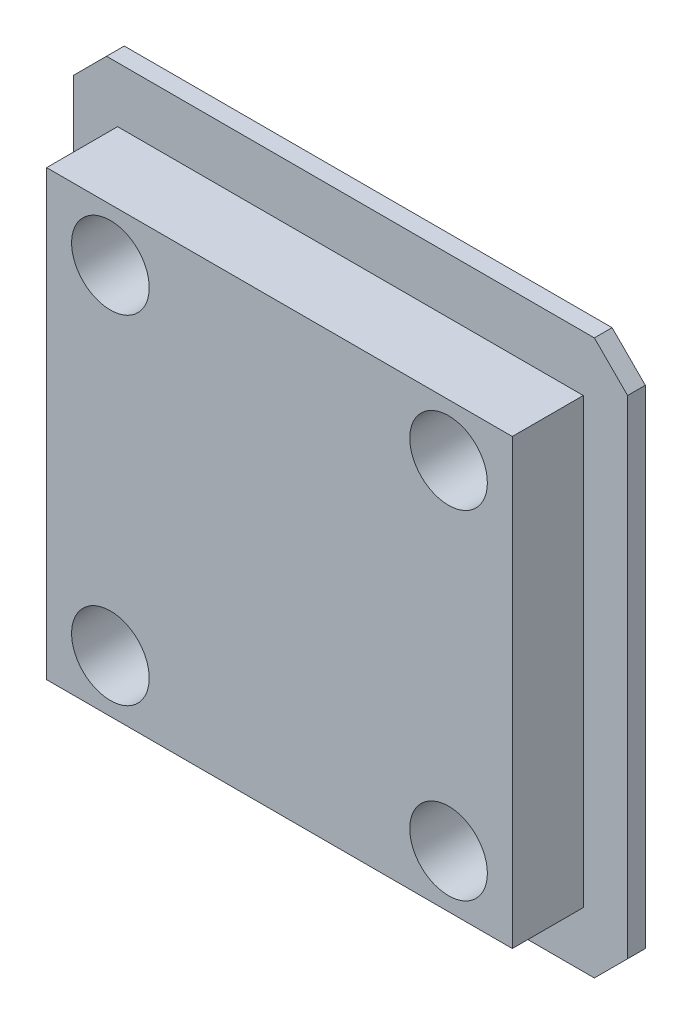
ISO-10303-21;
HEADER;
FILE_DESCRIPTION(('STEP AP214'),'2;1');
FILE_NAME('part.step','',(''),(''),'','','');
FILE_SCHEMA(('AUTOMOTIVE_DESIGN { 1 0 10303 214 1 1 1 1 }'));
ENDSEC;
DATA;
#1=APPLICATION_CONTEXT('core data for automotive mechanical design processes');
#2=APPLICATION_PROTOCOL_DEFINITION('international standard','automotive_design',2000,#1);
#3=PRODUCT_CONTEXT('',#1,'mechanical');
#4=PRODUCT('Part','Part','',(#3));
#5=PRODUCT_RELATED_PRODUCT_CATEGORY('part','',(#4));
#6=PRODUCT_DEFINITION_FORMATION('','',#4);
#7=PRODUCT_DEFINITION_CONTEXT('part definition',#1,'design');
#8=PRODUCT_DEFINITION('design','',#6,#7);
#9=PRODUCT_DEFINITION_SHAPE('','',#8);
#10=(LENGTH_UNIT() NAMED_UNIT(*) SI_UNIT(.MILLI.,.METRE.));
#11=(NAMED_UNIT(*) PLANE_ANGLE_UNIT() SI_UNIT($,.RADIAN.));
#12=(NAMED_UNIT(*) SI_UNIT($,.STERADIAN.) SOLID_ANGLE_UNIT());
#13=UNCERTAINTY_MEASURE_WITH_UNIT(LENGTH_MEASURE(1.E-05),#10,'distance_accuracy_value','');
#14=(GEOMETRIC_REPRESENTATION_CONTEXT(3) GLOBAL_UNCERTAINTY_ASSIGNED_CONTEXT((#13)) GLOBAL_UNIT_ASSIGNED_CONTEXT((#10,
#11,#12)) REPRESENTATION_CONTEXT('',''));
#15=CARTESIAN_POINT('',(0.,0.,0.));
#16=DIRECTION('',(0.,0.,1.));
#17=DIRECTION('',(1.,0.,0.));
#18=AXIS2_PLACEMENT_3D('',#15,#16,#17);
#19=CARTESIAN_POINT('',(0.,0.,1.6));
#20=DIRECTION('',(0.,0.,1.));
#21=DIRECTION('',(1.,0.,0.));
#22=AXIS2_PLACEMENT_3D('',#19,#20,#21);
#23=PLANE('',#22);
#24=DIRECTION('',(0.707106781186547,-0.707106781186547,0.));
#25=VECTOR('',#24,1.);
#26=CARTESIAN_POINT('',(-25.,-22.,1.6));
#27=LINE('',#26,#25);
#28=CARTESIAN_POINT('',(-25.,-22.,1.6));
#29=VERTEX_POINT('',#28);
#30=CARTESIAN_POINT('',(-22.,-25.,1.6));
#31=VERTEX_POINT('',#30);
#32=EDGE_CURVE('E166',#29,#31,#27,.T.);
#33=ORIENTED_EDGE('',*,*,#32,.T.);
#34=DIRECTION('',(1.,0.,0.));
#35=VECTOR('',#34,1.);
#36=CARTESIAN_POINT('',(-22.,-25.,1.6));
#37=LINE('',#36,#35);
#38=CARTESIAN_POINT('',(22.,-25.,1.6));
#39=VERTEX_POINT('',#38);
#40=EDGE_CURVE('E106',#31,#39,#37,.T.);
#41=ORIENTED_EDGE('',*,*,#40,.T.);
#42=DIRECTION('',(0.707106781186547,0.707106781186547,0.));
#43=VECTOR('',#42,1.);
#44=CARTESIAN_POINT('',(22.,-25.,1.6));
#45=LINE('',#44,#43);
#46=CARTESIAN_POINT('',(25.,-22.,1.6));
#47=VERTEX_POINT('',#46);
#48=EDGE_CURVE('E181',#39,#47,#45,.T.);
#49=ORIENTED_EDGE('',*,*,#48,.T.);
#50=DIRECTION('',(0.,1.,0.));
#51=VECTOR('',#50,1.);
#52=CARTESIAN_POINT('',(25.,-22.,1.6));
#53=LINE('',#52,#51);
#54=CARTESIAN_POINT('',(25.,22.,1.6));
#55=VERTEX_POINT('',#54);
#56=EDGE_CURVE('E194',#47,#55,#53,.T.);
#57=ORIENTED_EDGE('',*,*,#56,.T.);
#58=DIRECTION('',(-0.707106781186547,0.707106781186547,0.));
#59=VECTOR('',#58,1.);
#60=CARTESIAN_POINT('',(25.,22.,1.6));
#61=LINE('',#60,#59);
#62=CARTESIAN_POINT('',(22.,25.,1.6));
#63=VERTEX_POINT('',#62);
#64=EDGE_CURVE('E129',#55,#63,#61,.T.);
#65=ORIENTED_EDGE('',*,*,#64,.T.);
#66=DIRECTION('',(-1.,0.,0.));
#67=VECTOR('',#66,1.);
#68=CARTESIAN_POINT('',(22.,25.,1.6));
#69=LINE('',#68,#67);
#70=CARTESIAN_POINT('',(-22.,25.,1.6));
#71=VERTEX_POINT('',#70);
#72=EDGE_CURVE('E122',#63,#71,#69,.T.);
#73=ORIENTED_EDGE('',*,*,#72,.T.);
#74=DIRECTION('',(-0.707106781186547,-0.707106781186547,0.));
#75=VECTOR('',#74,1.);
#76=CARTESIAN_POINT('',(-22.,25.,1.6));
#77=LINE('',#76,#75);
#78=CARTESIAN_POINT('',(-25.,22.,1.6));
#79=VERTEX_POINT('',#78);
#80=EDGE_CURVE('E126',#71,#79,#77,.T.);
#81=ORIENTED_EDGE('',*,*,#80,.T.);
#82=DIRECTION('',(0.,-1.,0.));
#83=VECTOR('',#82,1.);
#84=CARTESIAN_POINT('',(-25.,22.,1.6));
#85=LINE('',#84,#83);
#86=EDGE_CURVE('E65',#79,#29,#85,.T.);
#87=ORIENTED_EDGE('',*,*,#86,.T.);
#88=EDGE_LOOP('',(#33,#41,#49,#57,#65,#73,#81,#87));
#89=FACE_BOUND('',#88,.T.);
#90=DIRECTION('',(1.,0.,0.));
#91=VECTOR('',#90,1.);
#92=CARTESIAN_POINT('',(-21.,-20.,1.6));
#93=LINE('',#92,#91);
#94=CARTESIAN_POINT('',(-21.,-20.,1.6));
#95=VERTEX_POINT('',#94);
#96=CARTESIAN_POINT('',(21.,-20.,1.6));
#97=VERTEX_POINT('',#96);
#98=EDGE_CURVE('E241',#95,#97,#93,.T.);
#99=ORIENTED_EDGE('',*,*,#98,.F.);
#100=DIRECTION('',(0.,-1.,0.));
#101=VECTOR('',#100,1.);
#102=CARTESIAN_POINT('',(-21.,20.,1.6));
#103=LINE('',#102,#101);
#104=CARTESIAN_POINT('',(-21.,20.,1.6));
#105=VERTEX_POINT('',#104);
#106=EDGE_CURVE('E225',#105,#95,#103,.T.);
#107=ORIENTED_EDGE('',*,*,#106,.F.);
#108=DIRECTION('',(-1.,0.,0.));
#109=VECTOR('',#108,1.);
#110=CARTESIAN_POINT('',(21.,20.,1.6));
#111=LINE('',#110,#109);
#112=CARTESIAN_POINT('',(21.,20.,1.6));
#113=VERTEX_POINT('',#112);
#114=EDGE_CURVE('E236',#113,#105,#111,.T.);
#115=ORIENTED_EDGE('',*,*,#114,.F.);
#116=DIRECTION('',(0.,1.,0.));
#117=VECTOR('',#116,1.);
#118=CARTESIAN_POINT('',(21.,-20.,1.6));
#119=LINE('',#118,#117);
#120=EDGE_CURVE('E239',#97,#113,#119,.T.);
#121=ORIENTED_EDGE('',*,*,#120,.F.);
#122=EDGE_LOOP('',(#99,#107,#115,#121));
#123=FACE_BOUND('',#122,.T.);
#124=ADVANCED_FACE('F41',(#89,#123),#23,.T.);
#125=CARTESIAN_POINT('',(0.,0.,0.));
#126=DIRECTION('',(0.,0.,1.));
#127=DIRECTION('',(1.,0.,0.));
#128=AXIS2_PLACEMENT_3D('',#125,#126,#127);
#129=PLANE('',#128);
#130=DIRECTION('',(0.707106781186547,-0.707106781186547,0.));
#131=VECTOR('',#130,1.);
#132=CARTESIAN_POINT('',(-25.,-22.,0.));
#133=LINE('',#132,#131);
#134=CARTESIAN_POINT('',(-25.,-22.,0.));
#135=VERTEX_POINT('',#134);
#136=CARTESIAN_POINT('',(-22.,-25.,0.));
#137=VERTEX_POINT('',#136);
#138=EDGE_CURVE('E150',#135,#137,#133,.T.);
#139=ORIENTED_EDGE('',*,*,#138,.F.);
#140=DIRECTION('',(0.,-1.,0.));
#141=VECTOR('',#140,1.);
#142=CARTESIAN_POINT('',(-25.,22.,0.));
#143=LINE('',#142,#141);
#144=CARTESIAN_POINT('',(-25.,22.,0.));
#145=VERTEX_POINT('',#144);
#146=EDGE_CURVE('E98',#145,#135,#143,.T.);
#147=ORIENTED_EDGE('',*,*,#146,.F.);
#148=DIRECTION('',(-0.707106781186547,-0.707106781186547,0.));
#149=VECTOR('',#148,1.);
#150=CARTESIAN_POINT('',(-22.,25.,0.));
#151=LINE('',#150,#149);
#152=CARTESIAN_POINT('',(-22.,25.,0.));
#153=VERTEX_POINT('',#152);
#154=EDGE_CURVE('E163',#153,#145,#151,.T.);
#155=ORIENTED_EDGE('',*,*,#154,.F.);
#156=DIRECTION('',(-1.,0.,0.));
#157=VECTOR('',#156,1.);
#158=CARTESIAN_POINT('',(22.,25.,0.));
#159=LINE('',#158,#157);
#160=CARTESIAN_POINT('',(22.,25.,0.));
#161=VERTEX_POINT('',#160);
#162=EDGE_CURVE('E138',#161,#153,#159,.T.);
#163=ORIENTED_EDGE('',*,*,#162,.F.);
#164=DIRECTION('',(-0.707106781186547,0.707106781186547,0.));
#165=VECTOR('',#164,1.);
#166=CARTESIAN_POINT('',(25.,22.,0.));
#167=LINE('',#166,#165);
#168=CARTESIAN_POINT('',(25.,22.,0.));
#169=VERTEX_POINT('',#168);
#170=EDGE_CURVE('E160',#169,#161,#167,.T.);
#171=ORIENTED_EDGE('',*,*,#170,.F.);
#172=DIRECTION('',(0.,1.,0.));
#173=VECTOR('',#172,1.);
#174=CARTESIAN_POINT('',(25.,-22.,0.));
#175=LINE('',#174,#173);
#176=CARTESIAN_POINT('',(25.,-22.,0.));
#177=VERTEX_POINT('',#176);
#178=EDGE_CURVE('E158',#177,#169,#175,.T.);
#179=ORIENTED_EDGE('',*,*,#178,.F.);
#180=DIRECTION('',(0.707106781186547,0.707106781186547,0.));
#181=VECTOR('',#180,1.);
#182=CARTESIAN_POINT('',(22.,-25.,0.));
#183=LINE('',#182,#181);
#184=CARTESIAN_POINT('',(22.,-25.,0.));
#185=VERTEX_POINT('',#184);
#186=EDGE_CURVE('E156',#185,#177,#183,.T.);
#187=ORIENTED_EDGE('',*,*,#186,.F.);
#188=DIRECTION('',(1.,0.,0.));
#189=VECTOR('',#188,1.);
#190=CARTESIAN_POINT('',(-22.,-25.,0.));
#191=LINE('',#190,#189);
#192=EDGE_CURVE('E153',#137,#185,#191,.T.);
#193=ORIENTED_EDGE('',*,*,#192,.F.);
#194=EDGE_LOOP('',(#139,#147,#155,#163,#171,#179,#187,#193));
#195=FACE_BOUND('',#194,.T.);
#196=CARTESIAN_POINT('',(-15.25,-15.25,0.));
#197=DIRECTION('',(0.,0.,1.));
#198=DIRECTION('',(1.,0.,0.));
#199=AXIS2_PLACEMENT_3D('',#196,#197,#198);
#200=CIRCLE('',#199,1.65);
#201=CARTESIAN_POINT('',(-13.6,-15.25,0.));
#202=VERTEX_POINT('',#201);
#203=EDGE_CURVE('E154',#202,#202,#200,.T.);
#204=ORIENTED_EDGE('',*,*,#203,.T.);
#205=EDGE_LOOP('',(#204));
#206=FACE_BOUND('',#205,.T.);
#207=CARTESIAN_POINT('',(-15.25,15.25,0.));
#208=DIRECTION('',(0.,0.,1.));
#209=DIRECTION('',(1.,0.,0.));
#210=AXIS2_PLACEMENT_3D('',#207,#208,#209);
#211=CIRCLE('',#210,1.65);
#212=CARTESIAN_POINT('',(-13.6,15.25,0.));
#213=VERTEX_POINT('',#212);
#214=EDGE_CURVE('E202',#213,#213,#211,.T.);
#215=ORIENTED_EDGE('',*,*,#214,.T.);
#216=EDGE_LOOP('',(#215));
#217=FACE_BOUND('',#216,.T.);
#218=CARTESIAN_POINT('',(15.25,-15.25,0.));
#219=DIRECTION('',(0.,0.,1.));
#220=DIRECTION('',(1.,0.,0.));
#221=AXIS2_PLACEMENT_3D('',#218,#219,#220);
#222=CIRCLE('',#221,1.65);
#223=CARTESIAN_POINT('',(16.9,-15.25,0.));
#224=VERTEX_POINT('',#223);
#225=EDGE_CURVE('E205',#224,#224,#222,.T.);
#226=ORIENTED_EDGE('',*,*,#225,.T.);
#227=EDGE_LOOP('',(#226));
#228=FACE_BOUND('',#227,.T.);
#229=CARTESIAN_POINT('',(15.25,15.25,0.));
#230=DIRECTION('',(0.,0.,1.));
#231=DIRECTION('',(1.,0.,0.));
#232=AXIS2_PLACEMENT_3D('',#229,#230,#231);
#233=CIRCLE('',#232,1.65);
#234=CARTESIAN_POINT('',(16.9,15.25,0.));
#235=VERTEX_POINT('',#234);
#236=EDGE_CURVE('E208',#235,#235,#233,.T.);
#237=ORIENTED_EDGE('',*,*,#236,.T.);
#238=EDGE_LOOP('',(#237));
#239=FACE_BOUND('',#238,.T.);
#240=ADVANCED_FACE('F185',(#195,#206,#217,#228,#239),#129,.F.);
#241=CARTESIAN_POINT('',(-25.,-22.,1.6));
#242=DIRECTION('',(0.707106781186548,0.707106781186548,0.));
#243=DIRECTION('',(-0.707106781186548,0.707106781186548,0.));
#244=AXIS2_PLACEMENT_3D('',#241,#242,#243);
#245=PLANE('',#244);
#246=ORIENTED_EDGE('',*,*,#138,.T.);
#247=DIRECTION('',(0.,0.,-1.));
#248=VECTOR('',#247,1.);
#249=CARTESIAN_POINT('',(-22.,-25.,1.6));
#250=LINE('',#249,#248);
#251=EDGE_CURVE('E11',#31,#137,#250,.T.);
#252=ORIENTED_EDGE('',*,*,#251,.F.);
#253=ORIENTED_EDGE('',*,*,#32,.F.);
#254=DIRECTION('',(0.,0.,-1.));
#255=VECTOR('',#254,1.);
#256=CARTESIAN_POINT('',(-25.,-22.,1.6));
#257=LINE('',#256,#255);
#258=EDGE_CURVE('E146',#29,#135,#257,.T.);
#259=ORIENTED_EDGE('',*,*,#258,.T.);
#260=EDGE_LOOP('',(#246,#252,#253,#259));
#261=FACE_BOUND('',#260,.T.);
#262=ADVANCED_FACE('F43',(#261),#245,.F.);
#263=CARTESIAN_POINT('',(-22.,-25.,1.6));
#264=DIRECTION('',(0.,1.,0.));
#265=DIRECTION('',(0.,0.,1.));
#266=AXIS2_PLACEMENT_3D('',#263,#264,#265);
#267=PLANE('',#266);
#268=ORIENTED_EDGE('',*,*,#192,.T.);
#269=DIRECTION('',(0.,0.,-1.));
#270=VECTOR('',#269,1.);
#271=CARTESIAN_POINT('',(22.,-25.,1.6));
#272=LINE('',#271,#270);
#273=EDGE_CURVE('E49',#39,#185,#272,.T.);
#274=ORIENTED_EDGE('',*,*,#273,.F.);
#275=ORIENTED_EDGE('',*,*,#40,.F.);
#276=ORIENTED_EDGE('',*,*,#251,.T.);
#277=EDGE_LOOP('',(#268,#274,#275,#276));
#278=FACE_BOUND('',#277,.T.);
#279=ADVANCED_FACE('F319',(#278),#267,.F.);
#280=CARTESIAN_POINT('',(22.,-25.,1.6));
#281=DIRECTION('',(-0.707106781186548,0.707106781186548,0.));
#282=DIRECTION('',(-0.707106781186548,-0.707106781186548,0.));
#283=AXIS2_PLACEMENT_3D('',#280,#281,#282);
#284=PLANE('',#283);
#285=ORIENTED_EDGE('',*,*,#186,.T.);
#286=DIRECTION('',(0.,0.,-1.));
#287=VECTOR('',#286,1.);
#288=CARTESIAN_POINT('',(25.,-22.,1.6));
#289=LINE('',#288,#287);
#290=EDGE_CURVE('E173',#47,#177,#289,.T.);
#291=ORIENTED_EDGE('',*,*,#290,.F.);
#292=ORIENTED_EDGE('',*,*,#48,.F.);
#293=ORIENTED_EDGE('',*,*,#273,.T.);
#294=EDGE_LOOP('',(#285,#291,#292,#293));
#295=FACE_BOUND('',#294,.T.);
#296=ADVANCED_FACE('F179',(#295),#284,.F.);
#297=CARTESIAN_POINT('',(25.,-22.,1.6));
#298=DIRECTION('',(-1.,0.,0.));
#299=DIRECTION('',(0.,0.,1.));
#300=AXIS2_PLACEMENT_3D('',#297,#298,#299);
#301=PLANE('',#300);
#302=ORIENTED_EDGE('',*,*,#178,.T.);
#303=DIRECTION('',(0.,0.,-1.));
#304=VECTOR('',#303,1.);
#305=CARTESIAN_POINT('',(25.,22.,1.6));
#306=LINE('',#305,#304);
#307=EDGE_CURVE('E170',#55,#169,#306,.T.);
#308=ORIENTED_EDGE('',*,*,#307,.F.);
#309=ORIENTED_EDGE('',*,*,#56,.F.);
#310=ORIENTED_EDGE('',*,*,#290,.T.);
#311=EDGE_LOOP('',(#302,#308,#309,#310));
#312=FACE_BOUND('',#311,.T.);
#313=ADVANCED_FACE('F190',(#312),#301,.F.);
#314=CARTESIAN_POINT('',(25.,22.,1.6));
#315=DIRECTION('',(-0.707106781186548,-0.707106781186548,0.));
#316=DIRECTION('',(0.707106781186548,-0.707106781186548,0.));
#317=AXIS2_PLACEMENT_3D('',#314,#315,#316);
#318=PLANE('',#317);
#319=ORIENTED_EDGE('',*,*,#170,.T.);
#320=DIRECTION('',(0.,0.,-1.));
#321=VECTOR('',#320,1.);
#322=CARTESIAN_POINT('',(22.,25.,1.6));
#323=LINE('',#322,#321);
#324=EDGE_CURVE('E141',#63,#161,#323,.T.);
#325=ORIENTED_EDGE('',*,*,#324,.F.);
#326=ORIENTED_EDGE('',*,*,#64,.F.);
#327=ORIENTED_EDGE('',*,*,#307,.T.);
#328=EDGE_LOOP('',(#319,#325,#326,#327));
#329=FACE_BOUND('',#328,.T.);
#330=ADVANCED_FACE('F193',(#329),#318,.F.);
#331=CARTESIAN_POINT('',(22.,25.,1.6));
#332=DIRECTION('',(0.,-1.,0.));
#333=DIRECTION('',(0.,0.,-1.));
#334=AXIS2_PLACEMENT_3D('',#331,#332,#333);
#335=PLANE('',#334);
#336=ORIENTED_EDGE('',*,*,#162,.T.);
#337=DIRECTION('',(0.,0.,-1.));
#338=VECTOR('',#337,1.);
#339=CARTESIAN_POINT('',(-22.,25.,1.6));
#340=LINE('',#339,#338);
#341=EDGE_CURVE('E135',#71,#153,#340,.T.);
#342=ORIENTED_EDGE('',*,*,#341,.F.);
#343=ORIENTED_EDGE('',*,*,#72,.F.);
#344=ORIENTED_EDGE('',*,*,#324,.T.);
#345=EDGE_LOOP('',(#336,#342,#343,#344));
#346=FACE_BOUND('',#345,.T.);
#347=ADVANCED_FACE('F136',(#346),#335,.F.);
#348=CARTESIAN_POINT('',(-22.,25.,1.6));
#349=DIRECTION('',(0.707106781186548,-0.707106781186548,0.));
#350=DIRECTION('',(0.707106781186548,0.707106781186548,0.));
#351=AXIS2_PLACEMENT_3D('',#348,#349,#350);
#352=PLANE('',#351);
#353=ORIENTED_EDGE('',*,*,#154,.T.);
#354=DIRECTION('',(0.,0.,-1.));
#355=VECTOR('',#354,1.);
#356=CARTESIAN_POINT('',(-25.,22.,1.6));
#357=LINE('',#356,#355);
#358=EDGE_CURVE('E142',#79,#145,#357,.T.);
#359=ORIENTED_EDGE('',*,*,#358,.F.);
#360=ORIENTED_EDGE('',*,*,#80,.F.);
#361=ORIENTED_EDGE('',*,*,#341,.T.);
#362=EDGE_LOOP('',(#353,#359,#360,#361));
#363=FACE_BOUND('',#362,.T.);
#364=ADVANCED_FACE('F144',(#363),#352,.F.);
#365=CARTESIAN_POINT('',(-25.,22.,1.6));
#366=DIRECTION('',(1.,0.,0.));
#367=DIRECTION('',(0.,0.,-1.));
#368=AXIS2_PLACEMENT_3D('',#365,#366,#367);
#369=PLANE('',#368);
#370=ORIENTED_EDGE('',*,*,#146,.T.);
#371=ORIENTED_EDGE('',*,*,#258,.F.);
#372=ORIENTED_EDGE('',*,*,#86,.F.);
#373=ORIENTED_EDGE('',*,*,#358,.T.);
#374=EDGE_LOOP('',(#370,#371,#372,#373));
#375=FACE_BOUND('',#374,.T.);
#376=ADVANCED_FACE('F307',(#375),#369,.F.);
#377=CARTESIAN_POINT('',(-15.25,-15.25,1.6));
#378=DIRECTION('',(0.,0.,-1.));
#379=DIRECTION('',(-1.,0.,0.));
#380=AXIS2_PLACEMENT_3D('',#377,#378,#379);
#381=CYLINDRICAL_SURFACE('',#380,1.65);
#382=CARTESIAN_POINT('',(-15.25,-15.25,1.6));
#383=DIRECTION('',(0.,0.,1.));
#384=DIRECTION('',(1.,0.,0.));
#385=AXIS2_PLACEMENT_3D('',#382,#383,#384);
#386=CIRCLE('',#385,1.65);
#387=CARTESIAN_POINT('',(-13.6,-15.25,1.6));
#388=VERTEX_POINT('',#387);
#389=EDGE_CURVE('E212',#388,#388,#386,.T.);
#390=ORIENTED_EDGE('',*,*,#389,.T.);
#391=EDGE_LOOP('',(#390));
#392=FACE_BOUND('',#391,.T.);
#393=ORIENTED_EDGE('',*,*,#203,.F.);
#394=EDGE_LOOP('',(#393));
#395=FACE_BOUND('',#394,.T.);
#396=ADVANCED_FACE('F304',(#392,#395),#381,.F.);
#397=CARTESIAN_POINT('',(-15.25,15.25,1.6));
#398=DIRECTION('',(0.,0.,-1.));
#399=DIRECTION('',(-1.,0.,0.));
#400=AXIS2_PLACEMENT_3D('',#397,#398,#399);
#401=CYLINDRICAL_SURFACE('',#400,1.65);
#402=CARTESIAN_POINT('',(-15.25,15.25,1.6));
#403=DIRECTION('',(0.,0.,1.));
#404=DIRECTION('',(1.,0.,0.));
#405=AXIS2_PLACEMENT_3D('',#402,#403,#404);
#406=CIRCLE('',#405,1.65);
#407=CARTESIAN_POINT('',(-13.6,15.25,1.6));
#408=VERTEX_POINT('',#407);
#409=EDGE_CURVE('E215',#408,#408,#406,.T.);
#410=ORIENTED_EDGE('',*,*,#409,.T.);
#411=EDGE_LOOP('',(#410));
#412=FACE_BOUND('',#411,.T.);
#413=ORIENTED_EDGE('',*,*,#214,.F.);
#414=EDGE_LOOP('',(#413));
#415=FACE_BOUND('',#414,.T.);
#416=ADVANCED_FACE('F398',(#412,#415),#401,.F.);
#417=CARTESIAN_POINT('',(15.25,-15.25,1.6));
#418=DIRECTION('',(0.,0.,-1.));
#419=DIRECTION('',(-1.,0.,0.));
#420=AXIS2_PLACEMENT_3D('',#417,#418,#419);
#421=CYLINDRICAL_SURFACE('',#420,1.65);
#422=CARTESIAN_POINT('',(15.25,-15.25,1.6));
#423=DIRECTION('',(0.,0.,1.));
#424=DIRECTION('',(1.,0.,0.));
#425=AXIS2_PLACEMENT_3D('',#422,#423,#424);
#426=CIRCLE('',#425,1.65);
#427=CARTESIAN_POINT('',(16.9,-15.25,1.6));
#428=VERTEX_POINT('',#427);
#429=EDGE_CURVE('E219',#428,#428,#426,.T.);
#430=ORIENTED_EDGE('',*,*,#429,.T.);
#431=EDGE_LOOP('',(#430));
#432=FACE_BOUND('',#431,.T.);
#433=ORIENTED_EDGE('',*,*,#225,.F.);
#434=EDGE_LOOP('',(#433));
#435=FACE_BOUND('',#434,.T.);
#436=ADVANCED_FACE('F408',(#432,#435),#421,.F.);
#437=CARTESIAN_POINT('',(15.25,15.25,1.6));
#438=DIRECTION('',(0.,0.,-1.));
#439=DIRECTION('',(-1.,0.,0.));
#440=AXIS2_PLACEMENT_3D('',#437,#438,#439);
#441=CYLINDRICAL_SURFACE('',#440,1.65);
#442=CARTESIAN_POINT('',(15.25,15.25,1.6));
#443=DIRECTION('',(0.,0.,1.));
#444=DIRECTION('',(1.,0.,0.));
#445=AXIS2_PLACEMENT_3D('',#442,#443,#444);
#446=CIRCLE('',#445,1.65);
#447=CARTESIAN_POINT('',(16.9,15.25,1.6));
#448=VERTEX_POINT('',#447);
#449=EDGE_CURVE('E222',#448,#448,#446,.T.);
#450=ORIENTED_EDGE('',*,*,#449,.T.);
#451=EDGE_LOOP('',(#450));
#452=FACE_BOUND('',#451,.T.);
#453=ORIENTED_EDGE('',*,*,#236,.F.);
#454=EDGE_LOOP('',(#453));
#455=FACE_BOUND('',#454,.T.);
#456=ADVANCED_FACE('F418',(#452,#455),#441,.F.);
#457=CARTESIAN_POINT('',(-21.,20.,8.));
#458=DIRECTION('',(1.,0.,0.));
#459=DIRECTION('',(0.,0.,-1.));
#460=AXIS2_PLACEMENT_3D('',#457,#458,#459);
#461=PLANE('',#460);
#462=ORIENTED_EDGE('',*,*,#106,.T.);
#463=DIRECTION('',(0.,0.,-1.));
#464=VECTOR('',#463,1.);
#465=CARTESIAN_POINT('',(-21.,-20.,8.));
#466=LINE('',#465,#464);
#467=CARTESIAN_POINT('',(-21.,-20.,8.));
#468=VERTEX_POINT('',#467);
#469=EDGE_CURVE('E211',#468,#95,#466,.T.);
#470=ORIENTED_EDGE('',*,*,#469,.F.);
#471=DIRECTION('',(0.,-1.,0.));
#472=VECTOR('',#471,1.);
#473=CARTESIAN_POINT('',(-21.,20.,8.));
#474=LINE('',#473,#472);
#475=CARTESIAN_POINT('',(-21.,20.,8.));
#476=VERTEX_POINT('',#475);
#477=EDGE_CURVE('E238',#476,#468,#474,.T.);
#478=ORIENTED_EDGE('',*,*,#477,.F.);
#479=DIRECTION('',(0.,0.,-1.));
#480=VECTOR('',#479,1.);
#481=CARTESIAN_POINT('',(-21.,20.,8.));
#482=LINE('',#481,#480);
#483=EDGE_CURVE('E232',#476,#105,#482,.T.);
#484=ORIENTED_EDGE('',*,*,#483,.T.);
#485=EDGE_LOOP('',(#462,#470,#478,#484));
#486=FACE_BOUND('',#485,.T.);
#487=ADVANCED_FACE('F429',(#486),#461,.F.);
#488=CARTESIAN_POINT('',(-21.,-20.,8.));
#489=DIRECTION('',(0.,1.,0.));
#490=DIRECTION('',(0.,0.,1.));
#491=AXIS2_PLACEMENT_3D('',#488,#489,#490);
#492=PLANE('',#491);
#493=ORIENTED_EDGE('',*,*,#98,.T.);
#494=DIRECTION('',(0.,0.,-1.));
#495=VECTOR('',#494,1.);
#496=CARTESIAN_POINT('',(21.,-20.,8.));
#497=LINE('',#496,#495);
#498=CARTESIAN_POINT('',(21.,-20.,8.));
#499=VERTEX_POINT('',#498);
#500=EDGE_CURVE('E228',#499,#97,#497,.T.);
#501=ORIENTED_EDGE('',*,*,#500,.F.);
#502=DIRECTION('',(1.,0.,0.));
#503=VECTOR('',#502,1.);
#504=CARTESIAN_POINT('',(-21.,-20.,8.));
#505=LINE('',#504,#503);
#506=EDGE_CURVE('E251',#468,#499,#505,.T.);
#507=ORIENTED_EDGE('',*,*,#506,.F.);
#508=ORIENTED_EDGE('',*,*,#469,.T.);
#509=EDGE_LOOP('',(#493,#501,#507,#508));
#510=FACE_BOUND('',#509,.T.);
#511=ADVANCED_FACE('F445',(#510),#492,.F.);
#512=CARTESIAN_POINT('',(21.,-20.,8.));
#513=DIRECTION('',(-1.,0.,0.));
#514=DIRECTION('',(0.,0.,1.));
#515=AXIS2_PLACEMENT_3D('',#512,#513,#514);
#516=PLANE('',#515);
#517=ORIENTED_EDGE('',*,*,#120,.T.);
#518=DIRECTION('',(0.,0.,-1.));
#519=VECTOR('',#518,1.);
#520=CARTESIAN_POINT('',(21.,20.,8.));
#521=LINE('',#520,#519);
#522=CARTESIAN_POINT('',(21.,20.,8.));
#523=VERTEX_POINT('',#522);
#524=EDGE_CURVE('E56',#523,#113,#521,.T.);
#525=ORIENTED_EDGE('',*,*,#524,.F.);
#526=DIRECTION('',(0.,1.,0.));
#527=VECTOR('',#526,1.);
#528=CARTESIAN_POINT('',(21.,-20.,8.));
#529=LINE('',#528,#527);
#530=EDGE_CURVE('E248',#499,#523,#529,.T.);
#531=ORIENTED_EDGE('',*,*,#530,.F.);
#532=ORIENTED_EDGE('',*,*,#500,.T.);
#533=EDGE_LOOP('',(#517,#525,#531,#532));
#534=FACE_BOUND('',#533,.T.);
#535=ADVANCED_FACE('F456',(#534),#516,.F.);
#536=CARTESIAN_POINT('',(21.,20.,8.));
#537=DIRECTION('',(0.,-1.,0.));
#538=DIRECTION('',(0.,0.,-1.));
#539=AXIS2_PLACEMENT_3D('',#536,#537,#538);
#540=PLANE('',#539);
#541=ORIENTED_EDGE('',*,*,#114,.T.);
#542=ORIENTED_EDGE('',*,*,#483,.F.);
#543=DIRECTION('',(-1.,0.,0.));
#544=VECTOR('',#543,1.);
#545=CARTESIAN_POINT('',(21.,20.,8.));
#546=LINE('',#545,#544);
#547=EDGE_CURVE('E235',#523,#476,#546,.T.);
#548=ORIENTED_EDGE('',*,*,#547,.F.);
#549=ORIENTED_EDGE('',*,*,#524,.T.);
#550=EDGE_LOOP('',(#541,#542,#548,#549));
#551=FACE_BOUND('',#550,.T.);
#552=ADVANCED_FACE('F467',(#551),#540,.F.);
#553=CARTESIAN_POINT('',(0.,0.,8.));
#554=DIRECTION('',(0.,0.,1.));
#555=DIRECTION('',(1.,0.,0.));
#556=AXIS2_PLACEMENT_3D('',#553,#554,#555);
#557=PLANE('',#556);
#558=CARTESIAN_POINT('',(-15.25,15.25,8.));
#559=DIRECTION('',(0.,0.,1.));
#560=DIRECTION('',(1.,0.,0.));
#561=AXIS2_PLACEMENT_3D('',#558,#559,#560);
#562=CIRCLE('',#561,3.5);
#563=CARTESIAN_POINT('',(-11.75,15.25,8.));
#564=VERTEX_POINT('',#563);
#565=EDGE_CURVE('E269',#564,#564,#562,.T.);
#566=ORIENTED_EDGE('',*,*,#565,.F.);
#567=EDGE_LOOP('',(#566));
#568=FACE_BOUND('',#567,.T.);
#569=CARTESIAN_POINT('',(15.25,-15.25,8.));
#570=DIRECTION('',(0.,0.,1.));
#571=DIRECTION('',(1.,0.,0.));
#572=AXIS2_PLACEMENT_3D('',#569,#570,#571);
#573=CIRCLE('',#572,3.5);
#574=CARTESIAN_POINT('',(18.75,-15.25,8.));
#575=VERTEX_POINT('',#574);
#576=EDGE_CURVE('E262',#575,#575,#573,.T.);
#577=ORIENTED_EDGE('',*,*,#576,.F.);
#578=EDGE_LOOP('',(#577));
#579=FACE_BOUND('',#578,.T.);
#580=CARTESIAN_POINT('',(15.25,15.25,8.));
#581=DIRECTION('',(0.,0.,1.));
#582=DIRECTION('',(1.,0.,0.));
#583=AXIS2_PLACEMENT_3D('',#580,#581,#582);
#584=CIRCLE('',#583,3.5);
#585=CARTESIAN_POINT('',(18.75,15.25,8.));
#586=VERTEX_POINT('',#585);
#587=EDGE_CURVE('E274',#586,#586,#584,.T.);
#588=ORIENTED_EDGE('',*,*,#587,.F.);
#589=EDGE_LOOP('',(#588));
#590=FACE_BOUND('',#589,.T.);
#591=CARTESIAN_POINT('',(-15.25,-15.25,8.));
#592=DIRECTION('',(0.,0.,1.));
#593=DIRECTION('',(1.,0.,0.));
#594=AXIS2_PLACEMENT_3D('',#591,#592,#593);
#595=CIRCLE('',#594,3.5);
#596=CARTESIAN_POINT('',(-11.75,-15.25,8.));
#597=VERTEX_POINT('',#596);
#598=EDGE_CURVE('E216',#597,#597,#595,.T.);
#599=ORIENTED_EDGE('',*,*,#598,.F.);
#600=EDGE_LOOP('',(#599));
#601=FACE_BOUND('',#600,.T.);
#602=ORIENTED_EDGE('',*,*,#477,.T.);
#603=ORIENTED_EDGE('',*,*,#506,.T.);
#604=ORIENTED_EDGE('',*,*,#530,.T.);
#605=ORIENTED_EDGE('',*,*,#547,.T.);
#606=EDGE_LOOP('',(#602,#603,#604,#605));
#607=FACE_BOUND('',#606,.T.);
#608=ADVANCED_FACE('F478',(#568,#579,#590,#601,#607),#557,.T.);
#609=CARTESIAN_POINT('',(-15.25,-15.25,8.));
#610=DIRECTION('',(0.,0.,-1.));
#611=DIRECTION('',(-1.,0.,0.));
#612=AXIS2_PLACEMENT_3D('',#609,#610,#611);
#613=CYLINDRICAL_SURFACE('',#612,3.5);
#614=ORIENTED_EDGE('',*,*,#598,.T.);
#615=EDGE_LOOP('',(#614));
#616=FACE_BOUND('',#615,.T.);
#617=CARTESIAN_POINT('',(-15.25,-15.25,1.6));
#618=DIRECTION('',(0.,0.,1.));
#619=DIRECTION('',(1.,0.,0.));
#620=AXIS2_PLACEMENT_3D('',#617,#618,#619);
#621=CIRCLE('',#620,3.5);
#622=CARTESIAN_POINT('',(-11.75,-15.25,1.6));
#623=VERTEX_POINT('',#622);
#624=EDGE_CURVE('E256',#623,#623,#621,.T.);
#625=ORIENTED_EDGE('',*,*,#624,.F.);
#626=EDGE_LOOP('',(#625));
#627=FACE_BOUND('',#626,.T.);
#628=ADVANCED_FACE('F294',(#616,#627),#613,.F.);
#629=CARTESIAN_POINT('',(-15.25,-15.25,1.6));
#630=DIRECTION('',(0.,0.,1.));
#631=DIRECTION('',(1.,0.,0.));
#632=AXIS2_PLACEMENT_3D('',#629,#630,#631);
#633=PLANE('',#632);
#634=ORIENTED_EDGE('',*,*,#389,.F.);
#635=EDGE_LOOP('',(#634));
#636=FACE_BOUND('',#635,.T.);
#637=ORIENTED_EDGE('',*,*,#624,.T.);
#638=EDGE_LOOP('',(#637));
#639=FACE_BOUND('',#638,.T.);
#640=ADVANCED_FACE('F284',(#636,#639),#633,.T.);
#641=CARTESIAN_POINT('',(15.25,15.25,8.));
#642=DIRECTION('',(0.,0.,-1.));
#643=DIRECTION('',(-1.,0.,0.));
#644=AXIS2_PLACEMENT_3D('',#641,#642,#643);
#645=CYLINDRICAL_SURFACE('',#644,3.5);
#646=ORIENTED_EDGE('',*,*,#587,.T.);
#647=EDGE_LOOP('',(#646));
#648=FACE_BOUND('',#647,.T.);
#649=CARTESIAN_POINT('',(15.25,15.25,1.6));
#650=DIRECTION('',(0.,0.,1.));
#651=DIRECTION('',(1.,0.,0.));
#652=AXIS2_PLACEMENT_3D('',#649,#650,#651);
#653=CIRCLE('',#652,3.5);
#654=CARTESIAN_POINT('',(18.75,15.25,1.6));
#655=VERTEX_POINT('',#654);
#656=EDGE_CURVE('E266',#655,#655,#653,.T.);
#657=ORIENTED_EDGE('',*,*,#656,.F.);
#658=EDGE_LOOP('',(#657));
#659=FACE_BOUND('',#658,.T.);
#660=ADVANCED_FACE('F282',(#648,#659),#645,.F.);
#661=CARTESIAN_POINT('',(15.25,15.25,1.6));
#662=DIRECTION('',(0.,0.,1.));
#663=DIRECTION('',(1.,0.,0.));
#664=AXIS2_PLACEMENT_3D('',#661,#662,#663);
#665=PLANE('',#664);
#666=ORIENTED_EDGE('',*,*,#449,.F.);
#667=EDGE_LOOP('',(#666));
#668=FACE_BOUND('',#667,.T.);
#669=ORIENTED_EDGE('',*,*,#656,.T.);
#670=EDGE_LOOP('',(#669));
#671=FACE_BOUND('',#670,.T.);
#672=ADVANCED_FACE('F280',(#668,#671),#665,.T.);
#673=CARTESIAN_POINT('',(15.25,-15.25,8.));
#674=DIRECTION('',(0.,0.,-1.));
#675=DIRECTION('',(-1.,0.,0.));
#676=AXIS2_PLACEMENT_3D('',#673,#674,#675);
#677=CYLINDRICAL_SURFACE('',#676,3.5);
#678=ORIENTED_EDGE('',*,*,#576,.T.);
#679=EDGE_LOOP('',(#678));
#680=FACE_BOUND('',#679,.T.);
#681=CARTESIAN_POINT('',(15.25,-15.25,1.6));
#682=DIRECTION('',(0.,0.,1.));
#683=DIRECTION('',(1.,0.,0.));
#684=AXIS2_PLACEMENT_3D('',#681,#682,#683);
#685=CIRCLE('',#684,3.5);
#686=CARTESIAN_POINT('',(18.75,-15.25,1.6));
#687=VERTEX_POINT('',#686);
#688=EDGE_CURVE('E265',#687,#687,#685,.T.);
#689=ORIENTED_EDGE('',*,*,#688,.F.);
#690=EDGE_LOOP('',(#689));
#691=FACE_BOUND('',#690,.T.);
#692=ADVANCED_FACE('F291',(#680,#691),#677,.F.);
#693=CARTESIAN_POINT('',(15.25,-15.25,1.6));
#694=DIRECTION('',(0.,0.,1.));
#695=DIRECTION('',(1.,0.,0.));
#696=AXIS2_PLACEMENT_3D('',#693,#694,#695);
#697=PLANE('',#696);
#698=ORIENTED_EDGE('',*,*,#429,.F.);
#699=EDGE_LOOP('',(#698));
#700=FACE_BOUND('',#699,.T.);
#701=ORIENTED_EDGE('',*,*,#688,.T.);
#702=EDGE_LOOP('',(#701));
#703=FACE_BOUND('',#702,.T.);
#704=ADVANCED_FACE('F528',(#700,#703),#697,.T.);
#705=CARTESIAN_POINT('',(-15.25,15.25,8.));
#706=DIRECTION('',(0.,0.,-1.));
#707=DIRECTION('',(-1.,0.,0.));
#708=AXIS2_PLACEMENT_3D('',#705,#706,#707);
#709=CYLINDRICAL_SURFACE('',#708,3.5);
#710=ORIENTED_EDGE('',*,*,#565,.T.);
#711=EDGE_LOOP('',(#710));
#712=FACE_BOUND('',#711,.T.);
#713=CARTESIAN_POINT('',(-15.25,15.25,1.6));
#714=DIRECTION('',(0.,0.,1.));
#715=DIRECTION('',(1.,0.,0.));
#716=AXIS2_PLACEMENT_3D('',#713,#714,#715);
#717=CIRCLE('',#716,3.5);
#718=CARTESIAN_POINT('',(-11.75,15.25,1.6));
#719=VERTEX_POINT('',#718);
#720=EDGE_CURVE('E259',#719,#719,#717,.T.);
#721=ORIENTED_EDGE('',*,*,#720,.F.);
#722=EDGE_LOOP('',(#721));
#723=FACE_BOUND('',#722,.T.);
#724=ADVANCED_FACE('F539',(#712,#723),#709,.F.);
#725=CARTESIAN_POINT('',(-15.25,15.25,1.6));
#726=DIRECTION('',(0.,0.,1.));
#727=DIRECTION('',(1.,0.,0.));
#728=AXIS2_PLACEMENT_3D('',#725,#726,#727);
#729=PLANE('',#728);
#730=ORIENTED_EDGE('',*,*,#409,.F.);
#731=EDGE_LOOP('',(#730));
#732=FACE_BOUND('',#731,.T.);
#733=ORIENTED_EDGE('',*,*,#720,.T.);
#734=EDGE_LOOP('',(#733));
#735=FACE_BOUND('',#734,.T.);
#736=ADVANCED_FACE('F550',(#732,#735),#729,.T.);
#737=CLOSED_SHELL('',(#124,#240,#262,#279,#296,#313,#330,#347,#364,#376,#396,#416,#436,#456,
#487,#511,#535,#552,#608,#628,#640,#660,#672,#692,#704,#724,#736));
#738=MANIFOLD_SOLID_BREP('B2',#737);
#739=ADVANCED_BREP_SHAPE_REPRESENTATION('',(#18,#738),#14);
#740=SHAPE_DEFINITION_REPRESENTATION(#9,#739);
ENDSEC;
END-ISO-10303-21;
